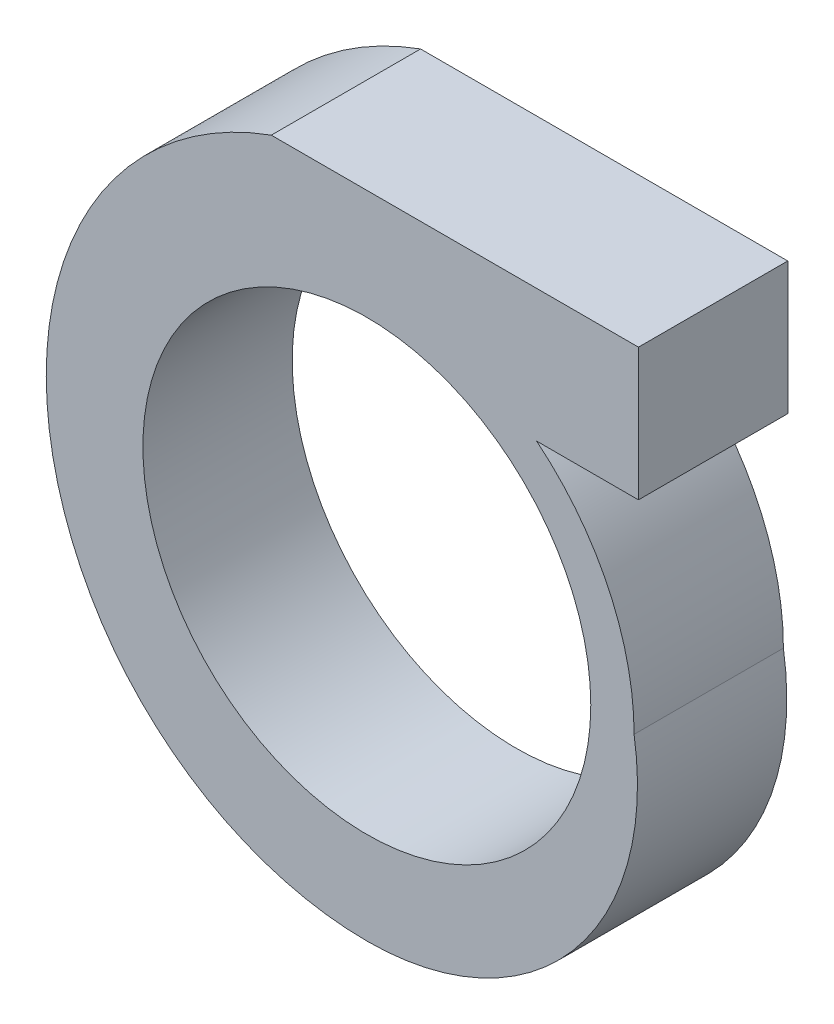
ISO-10303-21;
HEADER;
FILE_DESCRIPTION(('STEP AP214'),'2;1');
FILE_NAME('part.step','',(''),(''),'','','');
FILE_SCHEMA(('AUTOMOTIVE_DESIGN { 1 0 10303 214 1 1 1 1 }'));
ENDSEC;
DATA;
#1=APPLICATION_CONTEXT('core data for automotive mechanical design processes');
#2=APPLICATION_PROTOCOL_DEFINITION('international standard','automotive_design',2000,#1);
#3=PRODUCT_CONTEXT('',#1,'mechanical');
#4=PRODUCT('Part','Part','',(#3));
#5=PRODUCT_RELATED_PRODUCT_CATEGORY('part','',(#4));
#6=PRODUCT_DEFINITION_FORMATION('','',#4);
#7=PRODUCT_DEFINITION_CONTEXT('part definition',#1,'design');
#8=PRODUCT_DEFINITION('design','',#6,#7);
#9=PRODUCT_DEFINITION_SHAPE('','',#8);
#10=(LENGTH_UNIT() NAMED_UNIT(*) SI_UNIT(.MILLI.,.METRE.));
#11=(NAMED_UNIT(*) PLANE_ANGLE_UNIT() SI_UNIT($,.RADIAN.));
#12=(NAMED_UNIT(*) SI_UNIT($,.STERADIAN.) SOLID_ANGLE_UNIT());
#13=UNCERTAINTY_MEASURE_WITH_UNIT(LENGTH_MEASURE(1.E-05),#10,'distance_accuracy_value','');
#14=(GEOMETRIC_REPRESENTATION_CONTEXT(3) GLOBAL_UNCERTAINTY_ASSIGNED_CONTEXT((#13)) GLOBAL_UNIT_ASSIGNED_CONTEXT((#10,
#11,#12)) REPRESENTATION_CONTEXT('',''));
#15=CARTESIAN_POINT('',(0.,0.,0.));
#16=DIRECTION('',(0.,0.,1.));
#17=DIRECTION('',(1.,0.,0.));
#18=AXIS2_PLACEMENT_3D('',#15,#16,#17);
#19=CARTESIAN_POINT('',(5.3147811566444,4.5099770022846,20.));
#20=DIRECTION('',(0.,0.,-1.));
#21=DIRECTION('',(-1.,0.,0.));
#22=AXIS2_PLACEMENT_3D('',#19,#20,#21);
#23=CYLINDRICAL_SURFACE('',#22,91.3612635586836);
#24=CARTESIAN_POINT('',(5.3147811566444,4.5099770022846,-20.));
#25=DIRECTION('',(0.,0.,1.));
#26=DIRECTION('',(1.,0.,0.));
#27=AXIS2_PLACEMENT_3D('',#24,#25,#26);
#28=CIRCLE('',#27,91.3612635586836);
#29=CARTESIAN_POINT('',(-74.0512205614733,-40.7439537697378,-20.));
#30=VERTEX_POINT('',#29);
#31=CARTESIAN_POINT('',(-25.7529917742146,90.4266457235277,-20.));
#32=VERTEX_POINT('',#31);
#33=EDGE_CURVE('E138',#30,#32,#28,.F.);
#34=ORIENTED_EDGE('',*,*,#33,.F.);
#35=DIRECTION('',(0.,0.,-1.));
#36=VECTOR('',#35,1.);
#37=CARTESIAN_POINT('',(-74.0512205614733,-40.7439537697378,20.));
#38=LINE('',#37,#36);
#39=CARTESIAN_POINT('',(-74.0512205614733,-40.7439537697378,20.));
#40=VERTEX_POINT('',#39);
#41=EDGE_CURVE('E11',#40,#30,#38,.T.);
#42=ORIENTED_EDGE('',*,*,#41,.F.);
#43=CARTESIAN_POINT('',(5.3147811566444,4.5099770022846,20.));
#44=DIRECTION('',(0.,0.,1.));
#45=DIRECTION('',(1.,0.,0.));
#46=AXIS2_PLACEMENT_3D('',#43,#44,#45);
#47=CIRCLE('',#46,91.3612635586836);
#48=CARTESIAN_POINT('',(-25.7529917742146,90.4266457235277,20.));
#49=VERTEX_POINT('',#48);
#50=EDGE_CURVE('E156',#40,#49,#47,.F.);
#51=ORIENTED_EDGE('',*,*,#50,.T.);
#52=DIRECTION('',(0.,0.,-1.));
#53=VECTOR('',#52,1.);
#54=CARTESIAN_POINT('',(-25.7529917742146,90.4266457235277,20.));
#55=LINE('',#54,#53);
#56=EDGE_CURVE('E95',#49,#32,#55,.T.);
#57=ORIENTED_EDGE('',*,*,#56,.T.);
#58=EDGE_LOOP('',(#34,#42,#51,#57));
#59=FACE_BOUND('',#58,.T.);
#60=ADVANCED_FACE('F47',(#59),#23,.T.);
#61=CARTESIAN_POINT('',(0.,1.47952651562074,20.));
#62=DIRECTION('',(0.,0.,-1.));
#63=DIRECTION('',(-1.,0.,0.));
#64=AXIS2_PLACEMENT_3D('',#61,#62,#63);
#65=CYLINDRICAL_SURFACE('',#64,85.24321412319);
#66=CARTESIAN_POINT('',(0.,1.47952651562074,-20.));
#67=DIRECTION('',(0.,0.,1.));
#68=DIRECTION('',(1.,0.,0.));
#69=AXIS2_PLACEMENT_3D('',#66,#67,#68);
#70=CIRCLE('',#69,85.24321412319);
#71=CARTESIAN_POINT('',(0.,-83.7636876075693,-20.));
#72=VERTEX_POINT('',#71);
#73=EDGE_CURVE('E141',#72,#30,#70,.F.);
#74=ORIENTED_EDGE('',*,*,#73,.F.);
#75=DIRECTION('',(0.,0.,-1.));
#76=VECTOR('',#75,1.);
#77=CARTESIAN_POINT('',(0.,-83.7636876075693,20.));
#78=LINE('',#77,#76);
#79=CARTESIAN_POINT('',(0.,-83.7636876075693,20.));
#80=VERTEX_POINT('',#79);
#81=EDGE_CURVE('E55',#80,#72,#78,.T.);
#82=ORIENTED_EDGE('',*,*,#81,.F.);
#83=CARTESIAN_POINT('',(0.,1.47952651562074,20.));
#84=DIRECTION('',(0.,0.,1.));
#85=DIRECTION('',(1.,0.,0.));
#86=AXIS2_PLACEMENT_3D('',#83,#84,#85);
#87=CIRCLE('',#86,85.24321412319);
#88=EDGE_CURVE('E177',#80,#40,#87,.F.);
#89=ORIENTED_EDGE('',*,*,#88,.T.);
#90=ORIENTED_EDGE('',*,*,#41,.T.);
#91=EDGE_LOOP('',(#74,#82,#89,#90));
#92=FACE_BOUND('',#91,.T.);
#93=ADVANCED_FACE('F170',(#92),#65,.T.);
#94=CARTESIAN_POINT('',(0.,-11.401777134862,20.));
#95=DIRECTION('',(0.,0.,-1.));
#96=DIRECTION('',(-1.,0.,0.));
#97=AXIS2_PLACEMENT_3D('',#94,#95,#96);
#98=CYLINDRICAL_SURFACE('',#97,72.3619104727073);
#99=CARTESIAN_POINT('',(0.,-11.401777134862,-20.));
#100=DIRECTION('',(0.,0.,1.));
#101=DIRECTION('',(1.,0.,0.));
#102=AXIS2_PLACEMENT_3D('',#99,#100,#101);
#103=CIRCLE('',#102,72.3619104727073);
#104=CARTESIAN_POINT('',(71.4579986105617,0.,-20.));
#105=VERTEX_POINT('',#104);
#106=EDGE_CURVE('E144',#105,#72,#103,.F.);
#107=ORIENTED_EDGE('',*,*,#106,.F.);
#108=DIRECTION('',(0.,0.,-1.));
#109=VECTOR('',#108,1.);
#110=CARTESIAN_POINT('',(71.4579986105617,0.,20.));
#111=LINE('',#110,#109);
#112=CARTESIAN_POINT('',(71.4579986105617,0.,20.));
#113=VERTEX_POINT('',#112);
#114=EDGE_CURVE('E160',#113,#105,#111,.T.);
#115=ORIENTED_EDGE('',*,*,#114,.F.);
#116=CARTESIAN_POINT('',(0.,-11.401777134862,20.));
#117=DIRECTION('',(0.,0.,1.));
#118=DIRECTION('',(1.,0.,0.));
#119=AXIS2_PLACEMENT_3D('',#116,#117,#118);
#120=CIRCLE('',#119,72.3619104727073);
#121=EDGE_CURVE('E166',#113,#80,#120,.F.);
#122=ORIENTED_EDGE('',*,*,#121,.T.);
#123=ORIENTED_EDGE('',*,*,#81,.T.);
#124=EDGE_LOOP('',(#107,#115,#122,#123));
#125=FACE_BOUND('',#124,.T.);
#126=ADVANCED_FACE('F165',(#125),#98,.T.);
#127=CARTESIAN_POINT('',(0.505236387391325,0.,20.));
#128=DIRECTION('',(0.,0.,-1.));
#129=DIRECTION('',(-1.,0.,0.));
#130=AXIS2_PLACEMENT_3D('',#127,#128,#129);
#131=CYLINDRICAL_SURFACE('',#130,70.9527622231704);
#132=CARTESIAN_POINT('',(0.505236387391325,0.,-20.));
#133=DIRECTION('',(0.,0.,1.));
#134=DIRECTION('',(1.,0.,0.));
#135=AXIS2_PLACEMENT_3D('',#132,#133,#134);
#136=CIRCLE('',#135,70.9527622231704);
#137=CARTESIAN_POINT('',(45.3415438524107,54.9909083394701,-20.));
#138=VERTEX_POINT('',#137);
#139=EDGE_CURVE('E147',#105,#138,#136,.T.);
#140=ORIENTED_EDGE('',*,*,#139,.T.);
#141=DIRECTION('',(0.,0.,-1.));
#142=VECTOR('',#141,1.);
#143=CARTESIAN_POINT('',(45.3415438524107,54.9909083394701,20.));
#144=LINE('',#143,#142);
#145=CARTESIAN_POINT('',(45.3415438524107,54.9909083394701,20.));
#146=VERTEX_POINT('',#145);
#147=EDGE_CURVE('E127',#146,#138,#144,.T.);
#148=ORIENTED_EDGE('',*,*,#147,.F.);
#149=CARTESIAN_POINT('',(0.505236387391325,0.,20.));
#150=DIRECTION('',(0.,0.,1.));
#151=DIRECTION('',(1.,0.,0.));
#152=AXIS2_PLACEMENT_3D('',#149,#150,#151);
#153=CIRCLE('',#152,70.9527622231704);
#154=EDGE_CURVE('E118',#113,#146,#153,.T.);
#155=ORIENTED_EDGE('',*,*,#154,.F.);
#156=ORIENTED_EDGE('',*,*,#114,.T.);
#157=EDGE_LOOP('',(#140,#148,#155,#156));
#158=FACE_BOUND('',#157,.T.);
#159=ADVANCED_FACE('F176',(#158),#131,.T.);
#160=CARTESIAN_POINT('',(0.,54.9909083394701,20.));
#161=DIRECTION('',(0.,1.,0.));
#162=DIRECTION('',(0.,0.,1.));
#163=AXIS2_PLACEMENT_3D('',#160,#161,#162);
#164=PLANE('',#163);
#165=DIRECTION('',(1.,0.,0.));
#166=VECTOR('',#165,1.);
#167=CARTESIAN_POINT('',(0.,54.9909083394701,-20.));
#168=LINE('',#167,#166);
#169=CARTESIAN_POINT('',(72.6247811892771,54.9909083394701,-20.));
#170=VERTEX_POINT('',#169);
#171=EDGE_CURVE('E126',#138,#170,#168,.T.);
#172=ORIENTED_EDGE('',*,*,#171,.T.);
#173=DIRECTION('',(0.,0.,-1.));
#174=VECTOR('',#173,1.);
#175=CARTESIAN_POINT('',(72.6247811892771,54.9909083394701,20.));
#176=LINE('',#175,#174);
#177=CARTESIAN_POINT('',(72.6247811892771,54.9909083394701,20.));
#178=VERTEX_POINT('',#177);
#179=EDGE_CURVE('E123',#178,#170,#176,.T.);
#180=ORIENTED_EDGE('',*,*,#179,.F.);
#181=DIRECTION('',(1.,0.,0.));
#182=VECTOR('',#181,1.);
#183=CARTESIAN_POINT('',(0.,54.9909083394701,20.));
#184=LINE('',#183,#182);
#185=EDGE_CURVE('E110',#146,#178,#184,.T.);
#186=ORIENTED_EDGE('',*,*,#185,.F.);
#187=ORIENTED_EDGE('',*,*,#147,.T.);
#188=EDGE_LOOP('',(#172,#180,#186,#187));
#189=FACE_BOUND('',#188,.T.);
#190=ADVANCED_FACE('F124',(#189),#164,.F.);
#191=CARTESIAN_POINT('',(72.6247811892771,0.,20.));
#192=DIRECTION('',(-1.,0.,0.));
#193=DIRECTION('',(0.,0.,1.));
#194=AXIS2_PLACEMENT_3D('',#191,#192,#193);
#195=PLANE('',#194);
#196=DIRECTION('',(0.,1.,0.));
#197=VECTOR('',#196,1.);
#198=CARTESIAN_POINT('',(72.6247811892771,0.,-20.));
#199=LINE('',#198,#197);
#200=CARTESIAN_POINT('',(72.6247811892771,90.4266457235277,-20.));
#201=VERTEX_POINT('',#200);
#202=EDGE_CURVE('E88',#170,#201,#199,.T.);
#203=ORIENTED_EDGE('',*,*,#202,.T.);
#204=DIRECTION('',(0.,0.,-1.));
#205=VECTOR('',#204,1.);
#206=CARTESIAN_POINT('',(72.6247811892771,90.4266457235277,20.));
#207=LINE('',#206,#205);
#208=CARTESIAN_POINT('',(72.6247811892771,90.4266457235277,20.));
#209=VERTEX_POINT('',#208);
#210=EDGE_CURVE('E128',#209,#201,#207,.T.);
#211=ORIENTED_EDGE('',*,*,#210,.F.);
#212=DIRECTION('',(0.,1.,0.));
#213=VECTOR('',#212,1.);
#214=CARTESIAN_POINT('',(72.6247811892771,0.,20.));
#215=LINE('',#214,#213);
#216=EDGE_CURVE('E115',#178,#209,#215,.T.);
#217=ORIENTED_EDGE('',*,*,#216,.F.);
#218=ORIENTED_EDGE('',*,*,#179,.T.);
#219=EDGE_LOOP('',(#203,#211,#217,#218));
#220=FACE_BOUND('',#219,.T.);
#221=ADVANCED_FACE('F130',(#220),#195,.F.);
#222=CARTESIAN_POINT('',(0.,90.4266457235277,20.));
#223=DIRECTION('',(0.,-1.,0.));
#224=DIRECTION('',(0.,0.,-1.));
#225=AXIS2_PLACEMENT_3D('',#222,#223,#224);
#226=PLANE('',#225);
#227=DIRECTION('',(-1.,0.,0.));
#228=VECTOR('',#227,1.);
#229=CARTESIAN_POINT('',(0.,90.4266457235277,-20.));
#230=LINE('',#229,#228);
#231=EDGE_CURVE('E151',#201,#32,#230,.T.);
#232=ORIENTED_EDGE('',*,*,#231,.T.);
#233=ORIENTED_EDGE('',*,*,#56,.F.);
#234=DIRECTION('',(-1.,0.,0.));
#235=VECTOR('',#234,1.);
#236=CARTESIAN_POINT('',(0.,90.4266457235277,20.));
#237=LINE('',#236,#235);
#238=EDGE_CURVE('E63',#209,#49,#237,.T.);
#239=ORIENTED_EDGE('',*,*,#238,.F.);
#240=ORIENTED_EDGE('',*,*,#210,.T.);
#241=EDGE_LOOP('',(#232,#233,#239,#240));
#242=FACE_BOUND('',#241,.T.);
#243=ADVANCED_FACE('F196',(#242),#226,.F.);
#244=CARTESIAN_POINT('',(-0.148485531341163,0.959241536032867,20.));
#245=DIRECTION('',(0.,0.,-1.));
#246=DIRECTION('',(-1.,0.,0.));
#247=AXIS2_PLACEMENT_3D('',#244,#245,#246);
#248=CYLINDRICAL_SURFACE('',#247,60.);
#249=CARTESIAN_POINT('',(-0.148485531341163,0.959241536032867,20.));
#250=DIRECTION('',(0.,0.,1.));
#251=DIRECTION('',(1.,0.,0.));
#252=AXIS2_PLACEMENT_3D('',#249,#250,#251);
#253=CIRCLE('',#252,60.);
#254=CARTESIAN_POINT('',(59.8515144686588,0.959241536032867,20.));
#255=VERTEX_POINT('',#254);
#256=EDGE_CURVE('E132',#255,#255,#253,.T.);
#257=ORIENTED_EDGE('',*,*,#256,.T.);
#258=EDGE_LOOP('',(#257));
#259=FACE_BOUND('',#258,.T.);
#260=CARTESIAN_POINT('',(-0.148485531341163,0.959241536032867,-20.));
#261=DIRECTION('',(0.,0.,1.));
#262=DIRECTION('',(1.,0.,0.));
#263=AXIS2_PLACEMENT_3D('',#260,#261,#262);
#264=CIRCLE('',#263,60.);
#265=CARTESIAN_POINT('',(59.8515144686588,0.959241536032867,-20.));
#266=VERTEX_POINT('',#265);
#267=EDGE_CURVE('E153',#266,#266,#264,.T.);
#268=ORIENTED_EDGE('',*,*,#267,.F.);
#269=EDGE_LOOP('',(#268));
#270=FACE_BOUND('',#269,.T.);
#271=ADVANCED_FACE('F199',(#259,#270),#248,.F.);
#272=CARTESIAN_POINT('',(0.,0.,20.));
#273=DIRECTION('',(0.,0.,1.));
#274=DIRECTION('',(1.,0.,0.));
#275=AXIS2_PLACEMENT_3D('',#272,#273,#274);
#276=PLANE('',#275);
#277=ORIENTED_EDGE('',*,*,#50,.F.);
#278=ORIENTED_EDGE('',*,*,#88,.F.);
#279=ORIENTED_EDGE('',*,*,#121,.F.);
#280=ORIENTED_EDGE('',*,*,#154,.T.);
#281=ORIENTED_EDGE('',*,*,#185,.T.);
#282=ORIENTED_EDGE('',*,*,#216,.T.);
#283=ORIENTED_EDGE('',*,*,#238,.T.);
#284=EDGE_LOOP('',(#277,#278,#279,#280,#281,#282,#283));
#285=FACE_BOUND('',#284,.T.);
#286=ORIENTED_EDGE('',*,*,#256,.F.);
#287=EDGE_LOOP('',(#286));
#288=FACE_BOUND('',#287,.T.);
#289=ADVANCED_FACE('F112',(#285,#288),#276,.T.);
#290=CARTESIAN_POINT('',(0.,0.,-20.));
#291=DIRECTION('',(0.,0.,1.));
#292=DIRECTION('',(1.,0.,0.));
#293=AXIS2_PLACEMENT_3D('',#290,#291,#292);
#294=PLANE('',#293);
#295=ORIENTED_EDGE('',*,*,#33,.T.);
#296=ORIENTED_EDGE('',*,*,#231,.F.);
#297=ORIENTED_EDGE('',*,*,#202,.F.);
#298=ORIENTED_EDGE('',*,*,#171,.F.);
#299=ORIENTED_EDGE('',*,*,#139,.F.);
#300=ORIENTED_EDGE('',*,*,#106,.T.);
#301=ORIENTED_EDGE('',*,*,#73,.T.);
#302=EDGE_LOOP('',(#295,#296,#297,#298,#299,#300,#301));
#303=FACE_BOUND('',#302,.T.);
#304=ORIENTED_EDGE('',*,*,#267,.T.);
#305=EDGE_LOOP('',(#304));
#306=FACE_BOUND('',#305,.T.);
#307=ADVANCED_FACE('F173',(#303,#306),#294,.F.);
#308=CLOSED_SHELL('',(#60,#93,#126,#159,#190,#221,#243,#271,#289,#307));
#309=MANIFOLD_SOLID_BREP('B2',#308);
#310=ADVANCED_BREP_SHAPE_REPRESENTATION('',(#18,#309),#14);
#311=SHAPE_DEFINITION_REPRESENTATION(#9,#310);
ENDSEC;
END-ISO-10303-21;
